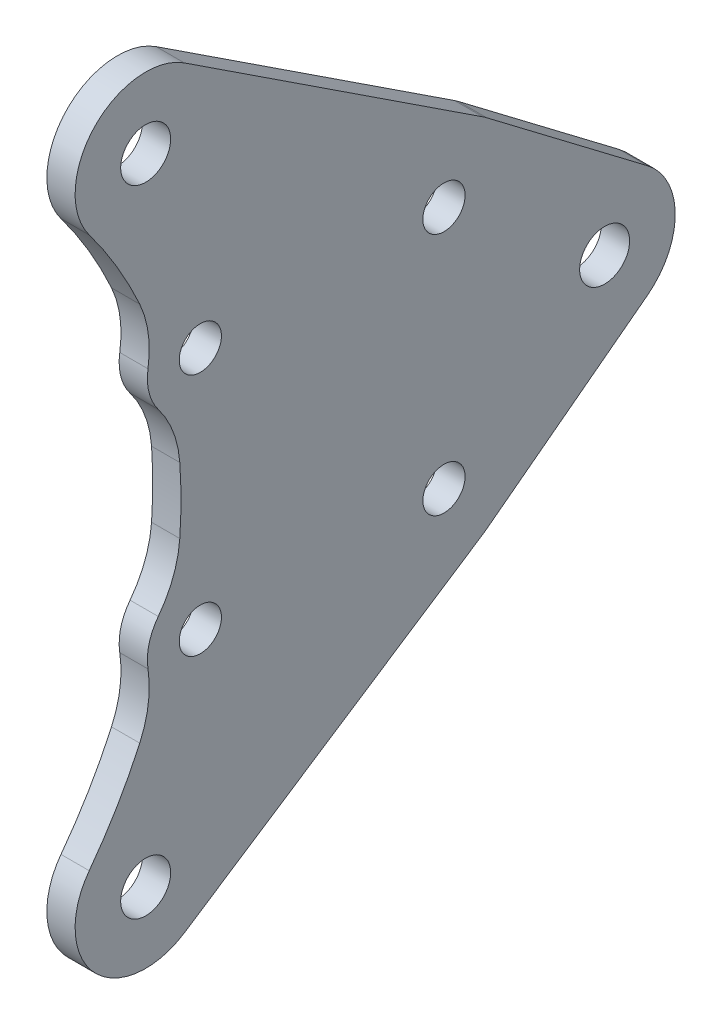
ISO-10303-21;
HEADER;
FILE_DESCRIPTION(('STEP AP214'),'2;1');
FILE_NAME('part.step','',(''),(''),'','','');
FILE_SCHEMA(('AUTOMOTIVE_DESIGN { 1 0 10303 214 1 1 1 1 }'));
ENDSEC;
DATA;
#1=APPLICATION_CONTEXT('core data for automotive mechanical design processes');
#2=APPLICATION_PROTOCOL_DEFINITION('international standard','automotive_design',2000,#1);
#3=PRODUCT_CONTEXT('',#1,'mechanical');
#4=PRODUCT('Part','Part','',(#3));
#5=PRODUCT_RELATED_PRODUCT_CATEGORY('part','',(#4));
#6=PRODUCT_DEFINITION_FORMATION('','',#4);
#7=PRODUCT_DEFINITION_CONTEXT('part definition',#1,'design');
#8=PRODUCT_DEFINITION('design','',#6,#7);
#9=PRODUCT_DEFINITION_SHAPE('','',#8);
#10=(LENGTH_UNIT() NAMED_UNIT(*) SI_UNIT(.MILLI.,.METRE.));
#11=(NAMED_UNIT(*) PLANE_ANGLE_UNIT() SI_UNIT($,.RADIAN.));
#12=(NAMED_UNIT(*) SI_UNIT($,.STERADIAN.) SOLID_ANGLE_UNIT());
#13=UNCERTAINTY_MEASURE_WITH_UNIT(LENGTH_MEASURE(1.E-05),#10,'distance_accuracy_value','');
#14=(GEOMETRIC_REPRESENTATION_CONTEXT(3) GLOBAL_UNCERTAINTY_ASSIGNED_CONTEXT((#13)) GLOBAL_UNIT_ASSIGNED_CONTEXT((#10,
#11,#12)) REPRESENTATION_CONTEXT('',''));
#15=CARTESIAN_POINT('',(0.,0.,0.));
#16=DIRECTION('',(0.,0.,1.));
#17=DIRECTION('',(1.,0.,0.));
#18=AXIS2_PLACEMENT_3D('',#15,#16,#17);
#19=CARTESIAN_POINT('',(2.54,0.,-25.4127));
#20=DIRECTION('',(-1.,0.,0.));
#21=DIRECTION('',(0.,0.,1.));
#22=AXIS2_PLACEMENT_3D('',#19,#20,#21);
#23=CYLINDRICAL_SURFACE('',#22,6.35);
#24=CARTESIAN_POINT('',(0.,0.,-25.4127));
#25=DIRECTION('',(1.,0.,0.));
#26=DIRECTION('',(0.,0.,-1.));
#27=AXIS2_PLACEMENT_3D('',#24,#25,#26);
#28=CIRCLE('',#27,6.35);
#29=CARTESIAN_POINT('',(0.,-5.05965389172381,-29.2496783027748));
#30=VERTEX_POINT('',#29);
#31=CARTESIAN_POINT('',(0.,5.05965389172381,-29.2496783027747));
#32=VERTEX_POINT('',#31);
#33=EDGE_CURVE('E191',#30,#32,#28,.T.);
#34=ORIENTED_EDGE('',*,*,#33,.T.);
#35=DIRECTION('',(-1.,0.,0.));
#36=VECTOR('',#35,1.);
#37=CARTESIAN_POINT('',(2.54,5.05965389172381,-29.2496783027747));
#38=LINE('',#37,#36);
#39=CARTESIAN_POINT('',(2.54,5.05965389172381,-29.2496783027747));
#40=VERTEX_POINT('',#39);
#41=EDGE_CURVE('E11',#40,#32,#38,.T.);
#42=ORIENTED_EDGE('',*,*,#41,.F.);
#43=CARTESIAN_POINT('',(2.54,0.,-25.4127));
#44=DIRECTION('',(1.,0.,0.));
#45=DIRECTION('',(0.,0.,-1.));
#46=AXIS2_PLACEMENT_3D('',#43,#44,#45);
#47=CIRCLE('',#46,6.35);
#48=CARTESIAN_POINT('',(2.54,-5.05965389172381,-29.2496783027748));
#49=VERTEX_POINT('',#48);
#50=EDGE_CURVE('E226',#49,#40,#47,.T.);
#51=ORIENTED_EDGE('',*,*,#50,.F.);
#52=DIRECTION('',(-1.,0.,0.));
#53=VECTOR('',#52,1.);
#54=CARTESIAN_POINT('',(2.54,-5.05965389172381,-29.2496783027748));
#55=LINE('',#54,#53);
#56=EDGE_CURVE('E187',#49,#30,#55,.T.);
#57=ORIENTED_EDGE('',*,*,#56,.T.);
#58=EDGE_LOOP('',(#34,#42,#51,#57));
#59=FACE_BOUND('',#58,.T.);
#60=ADVANCED_FACE('F35',(#59),#23,.T.);
#61=CARTESIAN_POINT('',(2.54,5.05965389172381,-29.2496783027747));
#62=DIRECTION('',(0.,-0.796795888460446,0.604248551618065));
#63=DIRECTION('',(0.,-0.604248551618065,-0.796795888460446));
#64=AXIS2_PLACEMENT_3D('',#61,#62,#63);
#65=PLANE('',#64);
#66=DIRECTION('',(0.,0.604248551618065,0.796795888460446));
#67=VECTOR('',#66,1.);
#68=CARTESIAN_POINT('',(0.,5.05965389172381,-29.2496783027747));
#69=LINE('',#68,#67);
#70=CARTESIAN_POINT('',(0.,16.0197538917236,-14.7970783027749));
#71=VERTEX_POINT('',#70);
#72=EDGE_CURVE('E194',#32,#71,#69,.T.);
#73=ORIENTED_EDGE('',*,*,#72,.T.);
#74=DIRECTION('',(-1.,0.,0.));
#75=VECTOR('',#74,1.);
#76=CARTESIAN_POINT('',(2.54,16.0197538917236,-14.7970783027749));
#77=LINE('',#76,#75);
#78=CARTESIAN_POINT('',(2.54,16.0197538917236,-14.7970783027749));
#79=VERTEX_POINT('',#78);
#80=EDGE_CURVE('E43',#79,#71,#77,.T.);
#81=ORIENTED_EDGE('',*,*,#80,.F.);
#82=DIRECTION('',(0.,0.604248551618065,0.796795888460446));
#83=VECTOR('',#82,1.);
#84=CARTESIAN_POINT('',(2.54,5.05965389172381,-29.2496783027747));
#85=LINE('',#84,#83);
#86=EDGE_CURVE('E124',#40,#79,#85,.T.);
#87=ORIENTED_EDGE('',*,*,#86,.F.);
#88=ORIENTED_EDGE('',*,*,#41,.T.);
#89=EDGE_LOOP('',(#73,#81,#87,#88));
#90=FACE_BOUND('',#89,.T.);
#91=ADVANCED_FACE('F335',(#90),#65,.F.);
#92=CARTESIAN_POINT('',(2.54,10.9600999999998,-10.9601000000001));
#93=DIRECTION('',(-1.,0.,0.));
#94=DIRECTION('',(0.,0.,1.));
#95=AXIS2_PLACEMENT_3D('',#92,#93,#94);
#96=CYLINDRICAL_SURFACE('',#95,6.35);
#97=CARTESIAN_POINT('',(0.,10.9600999999998,-10.9601000000001));
#98=DIRECTION('',(1.,0.,0.));
#99=DIRECTION('',(0.,0.,-1.));
#100=AXIS2_PLACEMENT_3D('',#97,#98,#99);
#101=CIRCLE('',#100,6.35);
#102=CARTESIAN_POINT('',(0.,16.2686080607358,-14.4446720209376));
#103=VERTEX_POINT('',#102);
#104=EDGE_CURVE('E197',#71,#103,#101,.T.);
#105=ORIENTED_EDGE('',*,*,#104,.T.);
#106=DIRECTION('',(-1.,0.,0.));
#107=VECTOR('',#106,1.);
#108=CARTESIAN_POINT('',(2.54,16.2686080607358,-14.4446720209376));
#109=LINE('',#108,#107);
#110=CARTESIAN_POINT('',(2.54,16.2686080607358,-14.4446720209376));
#111=VERTEX_POINT('',#110);
#112=EDGE_CURVE('E263',#111,#103,#109,.T.);
#113=ORIENTED_EDGE('',*,*,#112,.F.);
#114=CARTESIAN_POINT('',(2.54,10.9600999999998,-10.9601000000001));
#115=DIRECTION('',(1.,0.,0.));
#116=DIRECTION('',(0.,0.,-1.));
#117=AXIS2_PLACEMENT_3D('',#114,#115,#116);
#118=CIRCLE('',#117,6.35);
#119=EDGE_CURVE('E271',#79,#111,#118,.T.);
#120=ORIENTED_EDGE('',*,*,#119,.F.);
#121=ORIENTED_EDGE('',*,*,#80,.T.);
#122=EDGE_LOOP('',(#105,#113,#120,#121));
#123=FACE_BOUND('',#122,.T.);
#124=ADVANCED_FACE('F269',(#123),#96,.T.);
#125=CARTESIAN_POINT('',(2.54,16.2686080607358,-14.4446720209376));
#126=DIRECTION('',(0.,-0.835985521375755,0.548751499360236));
#127=DIRECTION('',(0.,-0.548751499360236,-0.835985521375755));
#128=AXIS2_PLACEMENT_3D('',#125,#126,#127);
#129=PLANE('',#128);
#130=DIRECTION('',(0.,0.548751499360236,0.835985521375755));
#131=VECTOR('',#130,1.);
#132=CARTESIAN_POINT('',(0.,16.2686080607358,-14.4446720209376));
#133=LINE('',#132,#131);
#134=CARTESIAN_POINT('',(0.,33.883508060736,12.3904279790625));
#135=VERTEX_POINT('',#134);
#136=EDGE_CURVE('E199',#103,#135,#133,.T.);
#137=ORIENTED_EDGE('',*,*,#136,.T.);
#138=DIRECTION('',(-1.,0.,0.));
#139=VECTOR('',#138,1.);
#140=CARTESIAN_POINT('',(2.54,33.883508060736,12.3904279790625));
#141=LINE('',#140,#139);
#142=CARTESIAN_POINT('',(2.54,33.883508060736,12.3904279790625));
#143=VERTEX_POINT('',#142);
#144=EDGE_CURVE('E260',#143,#135,#141,.T.);
#145=ORIENTED_EDGE('',*,*,#144,.F.);
#146=DIRECTION('',(0.,0.548751499360236,0.835985521375755));
#147=VECTOR('',#146,1.);
#148=CARTESIAN_POINT('',(2.54,16.2686080607358,-14.4446720209376));
#149=LINE('',#148,#147);
#150=EDGE_CURVE('E289',#111,#143,#149,.T.);
#151=ORIENTED_EDGE('',*,*,#150,.F.);
#152=ORIENTED_EDGE('',*,*,#112,.T.);
#153=EDGE_LOOP('',(#137,#145,#151,#152));
#154=FACE_BOUND('',#153,.T.);
#155=ADVANCED_FACE('F280',(#154),#129,.F.);
#156=CARTESIAN_POINT('',(2.54,28.575,15.875));
#157=DIRECTION('',(-1.,0.,0.));
#158=DIRECTION('',(0.,0.,1.));
#159=AXIS2_PLACEMENT_3D('',#156,#157,#158);
#160=CYLINDRICAL_SURFACE('',#159,6.35);
#161=CARTESIAN_POINT('',(0.,28.575,15.875));
#162=DIRECTION('',(1.,0.,0.));
#163=DIRECTION('',(0.,0.,-1.));
#164=AXIS2_PLACEMENT_3D('',#161,#162,#163);
#165=CIRCLE('',#164,6.35);
#166=CARTESIAN_POINT('',(0.,24.765,20.955));
#167=VERTEX_POINT('',#166);
#168=EDGE_CURVE('E201',#135,#167,#165,.T.);
#169=ORIENTED_EDGE('',*,*,#168,.T.);
#170=DIRECTION('',(-1.,0.,0.));
#171=VECTOR('',#170,1.);
#172=CARTESIAN_POINT('',(2.54,24.765,20.955));
#173=LINE('',#172,#171);
#174=CARTESIAN_POINT('',(2.54,24.765,20.955));
#175=VERTEX_POINT('',#174);
#176=EDGE_CURVE('E257',#175,#167,#173,.T.);
#177=ORIENTED_EDGE('',*,*,#176,.F.);
#178=CARTESIAN_POINT('',(2.54,28.575,15.875));
#179=DIRECTION('',(1.,0.,0.));
#180=DIRECTION('',(0.,0.,-1.));
#181=AXIS2_PLACEMENT_3D('',#178,#179,#180);
#182=CIRCLE('',#181,6.35);
#183=EDGE_CURVE('E286',#143,#175,#182,.T.);
#184=ORIENTED_EDGE('',*,*,#183,.F.);
#185=ORIENTED_EDGE('',*,*,#144,.T.);
#186=EDGE_LOOP('',(#169,#177,#184,#185));
#187=FACE_BOUND('',#186,.T.);
#188=ADVANCED_FACE('F284',(#187),#160,.T.);
#189=CARTESIAN_POINT('',(2.54,0.,53.975));
#190=DIRECTION('',(-1.,0.,0.));
#191=DIRECTION('',(0.,0.,1.));
#192=AXIS2_PLACEMENT_3D('',#189,#190,#191);
#193=CYLINDRICAL_SURFACE('',#192,41.275);
#194=CARTESIAN_POINT('',(0.,0.,53.975));
#195=DIRECTION('',(-1.,0.,0.));
#196=DIRECTION('',(0.,0.,-1.));
#197=AXIS2_PLACEMENT_3D('',#194,#195,#196);
#198=CIRCLE('',#197,41.275);
#199=CARTESIAN_POINT('',(0.,17.1004614147341,16.409060048986));
#200=VERTEX_POINT('',#199);
#201=EDGE_CURVE('E203',#167,#200,#198,.T.);
#202=ORIENTED_EDGE('',*,*,#201,.T.);
#203=DIRECTION('',(-1.,0.,0.));
#204=VECTOR('',#203,1.);
#205=CARTESIAN_POINT('',(2.54,17.1004614147341,16.409060048986));
#206=LINE('',#205,#204);
#207=CARTESIAN_POINT('',(2.54,17.1004614147341,16.409060048986));
#208=VERTEX_POINT('',#207);
#209=EDGE_CURVE('E254',#208,#200,#206,.T.);
#210=ORIENTED_EDGE('',*,*,#209,.F.);
#211=CARTESIAN_POINT('',(2.54,0.,53.975));
#212=DIRECTION('',(-1.,0.,0.));
#213=DIRECTION('',(0.,0.,-1.));
#214=AXIS2_PLACEMENT_3D('',#211,#212,#213);
#215=CIRCLE('',#214,41.275);
#216=EDGE_CURVE('E288',#175,#208,#215,.T.);
#217=ORIENTED_EDGE('',*,*,#216,.F.);
#218=ORIENTED_EDGE('',*,*,#176,.T.);
#219=EDGE_LOOP('',(#202,#210,#217,#218));
#220=FACE_BOUND('',#219,.T.);
#221=ADVANCED_FACE('F348',(#220),#193,.F.);
#222=CARTESIAN_POINT('',(2.54,13.154201088257,25.0781231146046));
#223=DIRECTION('',(-1.,0.,0.));
#224=DIRECTION('',(0.,0.,1.));
#225=AXIS2_PLACEMENT_3D('',#222,#223,#224);
#226=CYLINDRICAL_SURFACE('',#225,9.52499999999999);
#227=CARTESIAN_POINT('',(0.,13.154201088257,25.0781231146046));
#228=DIRECTION('',(-1.,0.,0.));
#229=DIRECTION('',(0.,0.,-1.));
#230=AXIS2_PLACEMENT_3D('',#227,#228,#229);
#231=CIRCLE('',#230,9.52499999999999);
#232=CARTESIAN_POINT('',(0.,11.691467029419,15.6661077048682));
#233=VERTEX_POINT('',#232);
#234=EDGE_CURVE('E205',#200,#233,#231,.T.);
#235=ORIENTED_EDGE('',*,*,#234,.T.);
#236=DIRECTION('',(-1.,0.,0.));
#237=VECTOR('',#236,1.);
#238=CARTESIAN_POINT('',(2.54,11.691467029419,15.6661077048682));
#239=LINE('',#238,#237);
#240=CARTESIAN_POINT('',(2.54,11.691467029419,15.6661077048682));
#241=VERTEX_POINT('',#240);
#242=EDGE_CURVE('E251',#241,#233,#239,.T.);
#243=ORIENTED_EDGE('',*,*,#242,.F.);
#244=CARTESIAN_POINT('',(2.54,13.154201088257,25.0781231146046));
#245=DIRECTION('',(-1.,0.,0.));
#246=DIRECTION('',(0.,0.,-1.));
#247=AXIS2_PLACEMENT_3D('',#244,#245,#246);
#248=CIRCLE('',#247,9.52499999999999);
#249=EDGE_CURVE('E291',#208,#241,#248,.T.);
#250=ORIENTED_EDGE('',*,*,#249,.F.);
#251=ORIENTED_EDGE('',*,*,#209,.T.);
#252=EDGE_LOOP('',(#235,#243,#250,#251));
#253=FACE_BOUND('',#252,.T.);
#254=ADVANCED_FACE('F351',(#253),#226,.F.);
#255=CARTESIAN_POINT('',(2.54,10.9601,10.9601));
#256=DIRECTION('',(-1.,0.,0.));
#257=DIRECTION('',(0.,0.,1.));
#258=AXIS2_PLACEMENT_3D('',#255,#256,#257);
#259=CYLINDRICAL_SURFACE('',#258,4.7625);
#260=CARTESIAN_POINT('',(0.,10.9601,10.9601));
#261=DIRECTION('',(1.,0.,0.));
#262=DIRECTION('',(0.,0.,-1.));
#263=AXIS2_PLACEMENT_3D('',#260,#261,#262);
#264=CIRCLE('',#263,4.7625);
#265=CARTESIAN_POINT('',(0.,8.06594812661788,14.7423336236408));
#266=VERTEX_POINT('',#265);
#267=EDGE_CURVE('E207',#233,#266,#264,.T.);
#268=ORIENTED_EDGE('',*,*,#267,.T.);
#269=DIRECTION('',(-1.,0.,0.));
#270=VECTOR('',#269,1.);
#271=CARTESIAN_POINT('',(2.54,8.06594812661788,14.7423336236408));
#272=LINE('',#271,#270);
#273=CARTESIAN_POINT('',(2.54,8.06594812661788,14.7423336236408));
#274=VERTEX_POINT('',#273);
#275=EDGE_CURVE('E248',#274,#266,#272,.T.);
#276=ORIENTED_EDGE('',*,*,#275,.F.);
#277=CARTESIAN_POINT('',(2.54,10.9601,10.9601));
#278=DIRECTION('',(1.,0.,0.));
#279=DIRECTION('',(0.,0.,-1.));
#280=AXIS2_PLACEMENT_3D('',#277,#278,#279);
#281=CIRCLE('',#280,4.7625);
#282=EDGE_CURVE('E297',#241,#274,#281,.T.);
#283=ORIENTED_EDGE('',*,*,#282,.F.);
#284=ORIENTED_EDGE('',*,*,#242,.T.);
#285=EDGE_LOOP('',(#268,#276,#283,#284));
#286=FACE_BOUND('',#285,.T.);
#287=ADVANCED_FACE('F355',(#286),#259,.T.);
#288=CARTESIAN_POINT('',(2.54,2.27764437985357,22.3068008709222));
#289=DIRECTION('',(-1.,0.,0.));
#290=DIRECTION('',(0.,0.,1.));
#291=AXIS2_PLACEMENT_3D('',#288,#289,#290);
#292=CYLINDRICAL_SURFACE('',#291,9.525);
#293=CARTESIAN_POINT('',(0.,2.27764437985357,22.3068008709222));
#294=DIRECTION('',(-1.,0.,0.));
#295=DIRECTION('',(0.,0.,1.));
#296=AXIS2_PLACEMENT_3D('',#293,#294,#295);
#297=CIRCLE('',#296,9.525);
#298=CARTESIAN_POINT('',(0.,2.96093769380964,12.8063411321989));
#299=VERTEX_POINT('',#298);
#300=EDGE_CURVE('E209',#266,#299,#297,.T.);
#301=ORIENTED_EDGE('',*,*,#300,.T.);
#302=DIRECTION('',(-1.,0.,0.));
#303=VECTOR('',#302,1.);
#304=CARTESIAN_POINT('',(2.54,2.96093769380964,12.8063411321989));
#305=LINE('',#304,#303);
#306=CARTESIAN_POINT('',(2.54,2.96093769380964,12.8063411321989));
#307=VERTEX_POINT('',#306);
#308=EDGE_CURVE('E245',#307,#299,#305,.T.);
#309=ORIENTED_EDGE('',*,*,#308,.F.);
#310=CARTESIAN_POINT('',(2.54,2.27764437985357,22.3068008709222));
#311=DIRECTION('',(-1.,0.,0.));
#312=DIRECTION('',(0.,0.,1.));
#313=AXIS2_PLACEMENT_3D('',#310,#311,#312);
#314=CIRCLE('',#313,9.525);
#315=EDGE_CURVE('E299',#274,#307,#314,.T.);
#316=ORIENTED_EDGE('',*,*,#315,.F.);
#317=ORIENTED_EDGE('',*,*,#275,.T.);
#318=EDGE_LOOP('',(#301,#309,#316,#317));
#319=FACE_BOUND('',#318,.T.);
#320=ADVANCED_FACE('F359',(#319),#292,.F.);
#321=CARTESIAN_POINT('',(2.54,0.,53.975));
#322=DIRECTION('',(-1.,0.,0.));
#323=DIRECTION('',(0.,0.,1.));
#324=AXIS2_PLACEMENT_3D('',#321,#322,#323);
#325=CYLINDRICAL_SURFACE('',#324,41.275);
#326=CARTESIAN_POINT('',(0.,0.,53.975));
#327=DIRECTION('',(-1.,0.,0.));
#328=DIRECTION('',(0.,0.,-1.));
#329=AXIS2_PLACEMENT_3D('',#326,#327,#328);
#330=CIRCLE('',#329,41.275);
#331=CARTESIAN_POINT('',(0.,-2.96093769380944,12.8063411321989));
#332=VERTEX_POINT('',#331);
#333=EDGE_CURVE('E211',#299,#332,#330,.T.);
#334=ORIENTED_EDGE('',*,*,#333,.T.);
#335=DIRECTION('',(-1.,0.,0.));
#336=VECTOR('',#335,1.);
#337=CARTESIAN_POINT('',(2.54,-2.96093769380944,12.8063411321989));
#338=LINE('',#337,#336);
#339=CARTESIAN_POINT('',(2.54,-2.96093769380944,12.8063411321989));
#340=VERTEX_POINT('',#339);
#341=EDGE_CURVE('E242',#340,#332,#338,.T.);
#342=ORIENTED_EDGE('',*,*,#341,.F.);
#343=CARTESIAN_POINT('',(2.54,0.,53.975));
#344=DIRECTION('',(-1.,0.,0.));
#345=DIRECTION('',(0.,0.,-1.));
#346=AXIS2_PLACEMENT_3D('',#343,#344,#345);
#347=CIRCLE('',#346,41.275);
#348=EDGE_CURVE('E301',#307,#340,#347,.T.);
#349=ORIENTED_EDGE('',*,*,#348,.F.);
#350=ORIENTED_EDGE('',*,*,#308,.T.);
#351=EDGE_LOOP('',(#334,#342,#349,#350));
#352=FACE_BOUND('',#351,.T.);
#353=ADVANCED_FACE('F363',(#352),#325,.F.);
#354=CARTESIAN_POINT('',(2.54,-2.27764437985341,22.3068008709222));
#355=DIRECTION('',(-1.,0.,0.));
#356=DIRECTION('',(0.,0.,1.));
#357=AXIS2_PLACEMENT_3D('',#354,#355,#356);
#358=CYLINDRICAL_SURFACE('',#357,9.525);
#359=CARTESIAN_POINT('',(0.,-2.27764437985341,22.3068008709222));
#360=DIRECTION('',(-1.,0.,0.));
#361=DIRECTION('',(0.,0.,-1.));
#362=AXIS2_PLACEMENT_3D('',#359,#360,#361);
#363=CIRCLE('',#362,9.525);
#364=CARTESIAN_POINT('',(0.,-8.06594812661781,14.7423336236408));
#365=VERTEX_POINT('',#364);
#366=EDGE_CURVE('E213',#332,#365,#363,.T.);
#367=ORIENTED_EDGE('',*,*,#366,.T.);
#368=DIRECTION('',(-1.,0.,0.));
#369=VECTOR('',#368,1.);
#370=CARTESIAN_POINT('',(2.54,-8.06594812661781,14.7423336236408));
#371=LINE('',#370,#369);
#372=CARTESIAN_POINT('',(2.54,-8.06594812661781,14.7423336236408));
#373=VERTEX_POINT('',#372);
#374=EDGE_CURVE('E239',#373,#365,#371,.T.);
#375=ORIENTED_EDGE('',*,*,#374,.F.);
#376=CARTESIAN_POINT('',(2.54,-2.27764437985341,22.3068008709222));
#377=DIRECTION('',(-1.,0.,0.));
#378=DIRECTION('',(0.,0.,-1.));
#379=AXIS2_PLACEMENT_3D('',#376,#377,#378);
#380=CIRCLE('',#379,9.525);
#381=EDGE_CURVE('E303',#340,#373,#380,.T.);
#382=ORIENTED_EDGE('',*,*,#381,.F.);
#383=ORIENTED_EDGE('',*,*,#341,.T.);
#384=EDGE_LOOP('',(#367,#375,#382,#383));
#385=FACE_BOUND('',#384,.T.);
#386=ADVANCED_FACE('F367',(#385),#358,.F.);
#387=CARTESIAN_POINT('',(2.54,-10.9601,10.9601000000001));
#388=DIRECTION('',(-1.,0.,0.));
#389=DIRECTION('',(0.,0.,1.));
#390=AXIS2_PLACEMENT_3D('',#387,#388,#389);
#391=CYLINDRICAL_SURFACE('',#390,4.7625);
#392=CARTESIAN_POINT('',(0.,-10.9601,10.9601000000001));
#393=DIRECTION('',(1.,0.,0.));
#394=DIRECTION('',(0.,0.,-1.));
#395=AXIS2_PLACEMENT_3D('',#392,#393,#394);
#396=CIRCLE('',#395,4.7625);
#397=CARTESIAN_POINT('',(0.,-11.6914670294191,15.6661077048683));
#398=VERTEX_POINT('',#397);
#399=EDGE_CURVE('E215',#365,#398,#396,.T.);
#400=ORIENTED_EDGE('',*,*,#399,.T.);
#401=DIRECTION('',(-1.,0.,0.));
#402=VECTOR('',#401,1.);
#403=CARTESIAN_POINT('',(2.54,-11.6914670294191,15.6661077048683));
#404=LINE('',#403,#402);
#405=CARTESIAN_POINT('',(2.54,-11.6914670294191,15.6661077048683));
#406=VERTEX_POINT('',#405);
#407=EDGE_CURVE('E236',#406,#398,#404,.T.);
#408=ORIENTED_EDGE('',*,*,#407,.F.);
#409=CARTESIAN_POINT('',(2.54,-10.9601,10.9601000000001));
#410=DIRECTION('',(1.,0.,0.));
#411=DIRECTION('',(0.,0.,-1.));
#412=AXIS2_PLACEMENT_3D('',#409,#410,#411);
#413=CIRCLE('',#412,4.7625);
#414=EDGE_CURVE('E305',#373,#406,#413,.T.);
#415=ORIENTED_EDGE('',*,*,#414,.F.);
#416=ORIENTED_EDGE('',*,*,#374,.T.);
#417=EDGE_LOOP('',(#400,#408,#415,#416));
#418=FACE_BOUND('',#417,.T.);
#419=ADVANCED_FACE('F371',(#418),#391,.T.);
#420=CARTESIAN_POINT('',(2.54,-13.1542010882571,25.0781231146047));
#421=DIRECTION('',(-1.,0.,0.));
#422=DIRECTION('',(0.,0.,1.));
#423=AXIS2_PLACEMENT_3D('',#420,#421,#422);
#424=CYLINDRICAL_SURFACE('',#423,9.525);
#425=CARTESIAN_POINT('',(0.,-13.1542010882571,25.0781231146047));
#426=DIRECTION('',(-1.,0.,0.));
#427=DIRECTION('',(0.,0.,1.));
#428=AXIS2_PLACEMENT_3D('',#425,#426,#427);
#429=CIRCLE('',#428,9.525);
#430=CARTESIAN_POINT('',(0.,-17.1004614147343,16.4090600489861));
#431=VERTEX_POINT('',#430);
#432=EDGE_CURVE('E217',#398,#431,#429,.T.);
#433=ORIENTED_EDGE('',*,*,#432,.T.);
#434=DIRECTION('',(-1.,0.,0.));
#435=VECTOR('',#434,1.);
#436=CARTESIAN_POINT('',(2.54,-17.1004614147343,16.4090600489861));
#437=LINE('',#436,#435);
#438=CARTESIAN_POINT('',(2.54,-17.1004614147343,16.4090600489861));
#439=VERTEX_POINT('',#438);
#440=EDGE_CURVE('E233',#439,#431,#437,.T.);
#441=ORIENTED_EDGE('',*,*,#440,.F.);
#442=CARTESIAN_POINT('',(2.54,-13.1542010882571,25.0781231146047));
#443=DIRECTION('',(-1.,0.,0.));
#444=DIRECTION('',(0.,0.,1.));
#445=AXIS2_PLACEMENT_3D('',#442,#443,#444);
#446=CIRCLE('',#445,9.525);
#447=EDGE_CURVE('E307',#406,#439,#446,.T.);
#448=ORIENTED_EDGE('',*,*,#447,.F.);
#449=ORIENTED_EDGE('',*,*,#407,.T.);
#450=EDGE_LOOP('',(#433,#441,#448,#449));
#451=FACE_BOUND('',#450,.T.);
#452=ADVANCED_FACE('F375',(#451),#424,.F.);
#453=CARTESIAN_POINT('',(2.54,0.,53.975));
#454=DIRECTION('',(-1.,0.,0.));
#455=DIRECTION('',(0.,0.,1.));
#456=AXIS2_PLACEMENT_3D('',#453,#454,#455);
#457=CYLINDRICAL_SURFACE('',#456,41.275);
#458=CARTESIAN_POINT('',(0.,0.,53.975));
#459=DIRECTION('',(-1.,0.,0.));
#460=DIRECTION('',(0.,0.,-1.));
#461=AXIS2_PLACEMENT_3D('',#458,#459,#460);
#462=CIRCLE('',#461,41.275);
#463=CARTESIAN_POINT('',(0.,-24.765,20.955));
#464=VERTEX_POINT('',#463);
#465=EDGE_CURVE('E219',#431,#464,#462,.T.);
#466=ORIENTED_EDGE('',*,*,#465,.T.);
#467=DIRECTION('',(-1.,0.,0.));
#468=VECTOR('',#467,1.);
#469=CARTESIAN_POINT('',(2.54,-24.765,20.955));
#470=LINE('',#469,#468);
#471=CARTESIAN_POINT('',(2.54,-24.765,20.955));
#472=VERTEX_POINT('',#471);
#473=EDGE_CURVE('E230',#472,#464,#470,.T.);
#474=ORIENTED_EDGE('',*,*,#473,.F.);
#475=CARTESIAN_POINT('',(2.54,0.,53.975));
#476=DIRECTION('',(-1.,0.,0.));
#477=DIRECTION('',(0.,0.,-1.));
#478=AXIS2_PLACEMENT_3D('',#475,#476,#477);
#479=CIRCLE('',#478,41.275);
#480=EDGE_CURVE('E309',#439,#472,#479,.T.);
#481=ORIENTED_EDGE('',*,*,#480,.F.);
#482=ORIENTED_EDGE('',*,*,#440,.T.);
#483=EDGE_LOOP('',(#466,#474,#481,#482));
#484=FACE_BOUND('',#483,.T.);
#485=ADVANCED_FACE('F315',(#484),#457,.F.);
#486=CARTESIAN_POINT('',(2.54,-28.575,15.875));
#487=DIRECTION('',(-1.,0.,0.));
#488=DIRECTION('',(0.,0.,1.));
#489=AXIS2_PLACEMENT_3D('',#486,#487,#488);
#490=CYLINDRICAL_SURFACE('',#489,6.35);
#491=CARTESIAN_POINT('',(0.,-28.575,15.875));
#492=DIRECTION('',(1.,0.,0.));
#493=DIRECTION('',(0.,0.,-1.));
#494=AXIS2_PLACEMENT_3D('',#491,#492,#493);
#495=CIRCLE('',#494,6.35);
#496=CARTESIAN_POINT('',(0.,-33.8835080607361,12.3904279790625));
#497=VERTEX_POINT('',#496);
#498=EDGE_CURVE('E221',#464,#497,#495,.T.);
#499=ORIENTED_EDGE('',*,*,#498,.T.);
#500=DIRECTION('',(-1.,0.,0.));
#501=VECTOR('',#500,1.);
#502=CARTESIAN_POINT('',(2.54,-33.8835080607361,12.3904279790625));
#503=LINE('',#502,#501);
#504=CARTESIAN_POINT('',(2.54,-33.8835080607361,12.3904279790625));
#505=VERTEX_POINT('',#504);
#506=EDGE_CURVE('E182',#505,#497,#503,.T.);
#507=ORIENTED_EDGE('',*,*,#506,.F.);
#508=CARTESIAN_POINT('',(2.54,-28.575,15.875));
#509=DIRECTION('',(1.,0.,0.));
#510=DIRECTION('',(0.,0.,-1.));
#511=AXIS2_PLACEMENT_3D('',#508,#509,#510);
#512=CIRCLE('',#511,6.35);
#513=EDGE_CURVE('E173',#472,#505,#512,.T.);
#514=ORIENTED_EDGE('',*,*,#513,.F.);
#515=ORIENTED_EDGE('',*,*,#473,.T.);
#516=EDGE_LOOP('',(#499,#507,#514,#515));
#517=FACE_BOUND('',#516,.T.);
#518=ADVANCED_FACE('F319',(#517),#490,.T.);
#519=CARTESIAN_POINT('',(2.54,-16.2686080607362,-14.4446720209375));
#520=DIRECTION('',(0.,0.835985521375758,0.548751499360231));
#521=DIRECTION('',(0.,-0.548751499360231,0.835985521375758));
#522=AXIS2_PLACEMENT_3D('',#519,#520,#521);
#523=PLANE('',#522);
#524=DIRECTION('',(0.,0.548751499360231,-0.835985521375758));
#525=VECTOR('',#524,1.);
#526=CARTESIAN_POINT('',(0.,-16.2686080607362,-14.4446720209375));
#527=LINE('',#526,#525);
#528=CARTESIAN_POINT('',(0.,-16.2686080607362,-14.4446720209375));
#529=VERTEX_POINT('',#528);
#530=EDGE_CURVE('E181',#497,#529,#527,.T.);
#531=ORIENTED_EDGE('',*,*,#530,.T.);
#532=DIRECTION('',(-1.,0.,0.));
#533=VECTOR('',#532,1.);
#534=CARTESIAN_POINT('',(2.54,-16.2686080607362,-14.4446720209375));
#535=LINE('',#534,#533);
#536=CARTESIAN_POINT('',(2.54,-16.2686080607362,-14.4446720209375));
#537=VERTEX_POINT('',#536);
#538=EDGE_CURVE('E178',#537,#529,#535,.T.);
#539=ORIENTED_EDGE('',*,*,#538,.F.);
#540=DIRECTION('',(0.,0.548751499360231,-0.835985521375758));
#541=VECTOR('',#540,1.);
#542=CARTESIAN_POINT('',(2.54,-16.2686080607362,-14.4446720209375));
#543=LINE('',#542,#541);
#544=EDGE_CURVE('E167',#505,#537,#543,.T.);
#545=ORIENTED_EDGE('',*,*,#544,.F.);
#546=ORIENTED_EDGE('',*,*,#506,.T.);
#547=EDGE_LOOP('',(#531,#539,#545,#546));
#548=FACE_BOUND('',#547,.T.);
#549=ADVANCED_FACE('F179',(#548),#523,.F.);
#550=CARTESIAN_POINT('',(2.54,-10.9601000000001,-10.9601));
#551=DIRECTION('',(-1.,0.,0.));
#552=DIRECTION('',(0.,0.,1.));
#553=AXIS2_PLACEMENT_3D('',#550,#551,#552);
#554=CYLINDRICAL_SURFACE('',#553,6.35);
#555=CARTESIAN_POINT('',(0.,-10.9601000000001,-10.9601));
#556=DIRECTION('',(1.,0.,0.));
#557=DIRECTION('',(0.,0.,-1.));
#558=AXIS2_PLACEMENT_3D('',#555,#556,#557);
#559=CIRCLE('',#558,6.35);
#560=CARTESIAN_POINT('',(0.,-16.0197538917239,-14.7970783027748));
#561=VERTEX_POINT('',#560);
#562=EDGE_CURVE('E110',#529,#561,#559,.T.);
#563=ORIENTED_EDGE('',*,*,#562,.T.);
#564=DIRECTION('',(-1.,0.,0.));
#565=VECTOR('',#564,1.);
#566=CARTESIAN_POINT('',(2.54,-16.0197538917239,-14.7970783027748));
#567=LINE('',#566,#565);
#568=CARTESIAN_POINT('',(2.54,-16.0197538917239,-14.7970783027748));
#569=VERTEX_POINT('',#568);
#570=EDGE_CURVE('E183',#569,#561,#567,.T.);
#571=ORIENTED_EDGE('',*,*,#570,.F.);
#572=CARTESIAN_POINT('',(2.54,-10.9601000000001,-10.9601));
#573=DIRECTION('',(1.,0.,0.));
#574=DIRECTION('',(0.,0.,-1.));
#575=AXIS2_PLACEMENT_3D('',#572,#573,#574);
#576=CIRCLE('',#575,6.35);
#577=EDGE_CURVE('E171',#537,#569,#576,.T.);
#578=ORIENTED_EDGE('',*,*,#577,.F.);
#579=ORIENTED_EDGE('',*,*,#538,.T.);
#580=EDGE_LOOP('',(#563,#571,#578,#579));
#581=FACE_BOUND('',#580,.T.);
#582=ADVANCED_FACE('F185',(#581),#554,.T.);
#583=CARTESIAN_POINT('',(2.54,-5.05965389172381,-29.2496783027748));
#584=DIRECTION('',(0.,0.796795888460441,0.604248551618072));
#585=DIRECTION('',(0.,-0.604248551618072,0.796795888460441));
#586=AXIS2_PLACEMENT_3D('',#583,#584,#585);
#587=PLANE('',#586);
#588=DIRECTION('',(0.,0.604248551618072,-0.796795888460441));
#589=VECTOR('',#588,1.);
#590=CARTESIAN_POINT('',(0.,-5.05965389172381,-29.2496783027748));
#591=LINE('',#590,#589);
#592=EDGE_CURVE('E116',#561,#30,#591,.T.);
#593=ORIENTED_EDGE('',*,*,#592,.T.);
#594=ORIENTED_EDGE('',*,*,#56,.F.);
#595=DIRECTION('',(0.,0.604248551618072,-0.796795888460441));
#596=VECTOR('',#595,1.);
#597=CARTESIAN_POINT('',(2.54,-5.05965389172381,-29.2496783027748));
#598=LINE('',#597,#596);
#599=EDGE_CURVE('E51',#569,#49,#598,.T.);
#600=ORIENTED_EDGE('',*,*,#599,.F.);
#601=ORIENTED_EDGE('',*,*,#570,.T.);
#602=EDGE_LOOP('',(#593,#594,#600,#601));
#603=FACE_BOUND('',#602,.T.);
#604=ADVANCED_FACE('F323',(#603),#587,.F.);
#605=CARTESIAN_POINT('',(2.54,0.,-25.4127));
#606=DIRECTION('',(1.,0.,0.));
#607=DIRECTION('',(0.,0.,-1.));
#608=AXIS2_PLACEMENT_3D('',#605,#606,#607);
#609=PLANE('',#608);
#610=CARTESIAN_POINT('',(2.54,10.9601,10.9601));
#611=DIRECTION('',(1.,0.,0.));
#612=DIRECTION('',(0.,0.,-1.));
#613=AXIS2_PLACEMENT_3D('',#610,#611,#612);
#614=CIRCLE('',#613,1.89865);
#615=CARTESIAN_POINT('',(2.54,10.9601,9.06145000000001));
#616=VERTEX_POINT('',#615);
#617=EDGE_CURVE('E491',#616,#616,#614,.T.);
#618=ORIENTED_EDGE('',*,*,#617,.F.);
#619=EDGE_LOOP('',(#618));
#620=FACE_BOUND('',#619,.T.);
#621=CARTESIAN_POINT('',(2.54,10.9600999999999,-10.9601));
#622=DIRECTION('',(1.,0.,0.));
#623=DIRECTION('',(0.,0.,-1.));
#624=AXIS2_PLACEMENT_3D('',#621,#622,#623);
#625=CIRCLE('',#624,1.89865);
#626=CARTESIAN_POINT('',(2.54,10.9600999999999,-12.85875));
#627=VERTEX_POINT('',#626);
#628=EDGE_CURVE('E493',#627,#627,#625,.T.);
#629=ORIENTED_EDGE('',*,*,#628,.F.);
#630=EDGE_LOOP('',(#629));
#631=FACE_BOUND('',#630,.T.);
#632=CARTESIAN_POINT('',(2.54,-10.9601,10.9601000000001));
#633=DIRECTION('',(1.,0.,0.));
#634=DIRECTION('',(0.,0.,-1.));
#635=AXIS2_PLACEMENT_3D('',#632,#633,#634);
#636=CIRCLE('',#635,1.89865);
#637=CARTESIAN_POINT('',(2.54,-10.9601,9.06145000000011));
#638=VERTEX_POINT('',#637);
#639=EDGE_CURVE('E501',#638,#638,#636,.T.);
#640=ORIENTED_EDGE('',*,*,#639,.F.);
#641=EDGE_LOOP('',(#640));
#642=FACE_BOUND('',#641,.T.);
#643=CARTESIAN_POINT('',(2.54,-10.9601,-10.9600999999999));
#644=DIRECTION('',(1.,0.,0.));
#645=DIRECTION('',(0.,0.,-1.));
#646=AXIS2_PLACEMENT_3D('',#643,#644,#645);
#647=CIRCLE('',#646,1.89865);
#648=CARTESIAN_POINT('',(2.54,-10.9601,-12.8587499999999));
#649=VERTEX_POINT('',#648);
#650=EDGE_CURVE('E507',#649,#649,#647,.T.);
#651=ORIENTED_EDGE('',*,*,#650,.F.);
#652=EDGE_LOOP('',(#651));
#653=FACE_BOUND('',#652,.T.);
#654=CARTESIAN_POINT('',(2.54,28.575,15.875));
#655=DIRECTION('',(1.,0.,0.));
#656=DIRECTION('',(0.,0.,-1.));
#657=AXIS2_PLACEMENT_3D('',#654,#655,#656);
#658=CIRCLE('',#657,2.2479);
#659=CARTESIAN_POINT('',(2.54,28.575,13.6271));
#660=VERTEX_POINT('',#659);
#661=EDGE_CURVE('E513',#660,#660,#658,.T.);
#662=ORIENTED_EDGE('',*,*,#661,.F.);
#663=EDGE_LOOP('',(#662));
#664=FACE_BOUND('',#663,.T.);
#665=CARTESIAN_POINT('',(2.54,0.,-25.4127));
#666=DIRECTION('',(1.,0.,0.));
#667=DIRECTION('',(0.,0.,-1.));
#668=AXIS2_PLACEMENT_3D('',#665,#666,#667);
#669=CIRCLE('',#668,2.2479);
#670=CARTESIAN_POINT('',(2.54,0.,-27.6606));
#671=VERTEX_POINT('',#670);
#672=EDGE_CURVE('E519',#671,#671,#669,.T.);
#673=ORIENTED_EDGE('',*,*,#672,.F.);
#674=EDGE_LOOP('',(#673));
#675=FACE_BOUND('',#674,.T.);
#676=CARTESIAN_POINT('',(2.54,-28.575,15.875));
#677=DIRECTION('',(1.,0.,0.));
#678=DIRECTION('',(0.,0.,-1.));
#679=AXIS2_PLACEMENT_3D('',#676,#677,#678);
#680=CIRCLE('',#679,2.2479);
#681=CARTESIAN_POINT('',(2.54,-28.575,13.6271));
#682=VERTEX_POINT('',#681);
#683=EDGE_CURVE('E525',#682,#682,#680,.T.);
#684=ORIENTED_EDGE('',*,*,#683,.F.);
#685=EDGE_LOOP('',(#684));
#686=FACE_BOUND('',#685,.T.);
#687=ORIENTED_EDGE('',*,*,#50,.T.);
#688=ORIENTED_EDGE('',*,*,#86,.T.);
#689=ORIENTED_EDGE('',*,*,#119,.T.);
#690=ORIENTED_EDGE('',*,*,#150,.T.);
#691=ORIENTED_EDGE('',*,*,#183,.T.);
#692=ORIENTED_EDGE('',*,*,#216,.T.);
#693=ORIENTED_EDGE('',*,*,#249,.T.);
#694=ORIENTED_EDGE('',*,*,#282,.T.);
#695=ORIENTED_EDGE('',*,*,#315,.T.);
#696=ORIENTED_EDGE('',*,*,#348,.T.);
#697=ORIENTED_EDGE('',*,*,#381,.T.);
#698=ORIENTED_EDGE('',*,*,#414,.T.);
#699=ORIENTED_EDGE('',*,*,#447,.T.);
#700=ORIENTED_EDGE('',*,*,#480,.T.);
#701=ORIENTED_EDGE('',*,*,#513,.T.);
#702=ORIENTED_EDGE('',*,*,#544,.T.);
#703=ORIENTED_EDGE('',*,*,#577,.T.);
#704=ORIENTED_EDGE('',*,*,#599,.T.);
#705=EDGE_LOOP('',(#687,#688,#689,#690,#691,#692,#693,#694,#695,#696,#697,#698,#699,#700,#701,
#702,#703,#704));
#706=FACE_BOUND('',#705,.T.);
#707=ADVANCED_FACE('F169',(#620,#631,#642,#653,#664,#675,#686,#706),#609,.T.);
#708=CARTESIAN_POINT('',(0.,0.,-25.4127));
#709=DIRECTION('',(1.,0.,0.));
#710=DIRECTION('',(0.,0.,-1.));
#711=AXIS2_PLACEMENT_3D('',#708,#709,#710);
#712=PLANE('',#711);
#713=CARTESIAN_POINT('',(0.,10.9601,10.9601));
#714=DIRECTION('',(1.,0.,0.));
#715=DIRECTION('',(0.,0.,-1.));
#716=AXIS2_PLACEMENT_3D('',#713,#714,#715);
#717=CIRCLE('',#716,1.89865);
#718=CARTESIAN_POINT('',(0.,10.9601,9.06145000000001));
#719=VERTEX_POINT('',#718);
#720=EDGE_CURVE('E488',#719,#719,#717,.T.);
#721=ORIENTED_EDGE('',*,*,#720,.T.);
#722=EDGE_LOOP('',(#721));
#723=FACE_BOUND('',#722,.T.);
#724=CARTESIAN_POINT('',(0.,10.9600999999999,-10.9601));
#725=DIRECTION('',(1.,0.,0.));
#726=DIRECTION('',(0.,0.,-1.));
#727=AXIS2_PLACEMENT_3D('',#724,#725,#726);
#728=CIRCLE('',#727,1.89865);
#729=CARTESIAN_POINT('',(0.,10.9600999999999,-12.85875));
#730=VERTEX_POINT('',#729);
#731=EDGE_CURVE('E498',#730,#730,#728,.T.);
#732=ORIENTED_EDGE('',*,*,#731,.T.);
#733=EDGE_LOOP('',(#732));
#734=FACE_BOUND('',#733,.T.);
#735=CARTESIAN_POINT('',(0.,-10.9601,10.9601000000001));
#736=DIRECTION('',(1.,0.,0.));
#737=DIRECTION('',(0.,0.,-1.));
#738=AXIS2_PLACEMENT_3D('',#735,#736,#737);
#739=CIRCLE('',#738,1.89865);
#740=CARTESIAN_POINT('',(0.,-10.9601,9.06145000000011));
#741=VERTEX_POINT('',#740);
#742=EDGE_CURVE('E504',#741,#741,#739,.T.);
#743=ORIENTED_EDGE('',*,*,#742,.T.);
#744=EDGE_LOOP('',(#743));
#745=FACE_BOUND('',#744,.T.);
#746=CARTESIAN_POINT('',(0.,-10.9601,-10.9600999999999));
#747=DIRECTION('',(1.,0.,0.));
#748=DIRECTION('',(0.,0.,-1.));
#749=AXIS2_PLACEMENT_3D('',#746,#747,#748);
#750=CIRCLE('',#749,1.89865);
#751=CARTESIAN_POINT('',(0.,-10.9601,-12.8587499999999));
#752=VERTEX_POINT('',#751);
#753=EDGE_CURVE('E510',#752,#752,#750,.T.);
#754=ORIENTED_EDGE('',*,*,#753,.T.);
#755=EDGE_LOOP('',(#754));
#756=FACE_BOUND('',#755,.T.);
#757=CARTESIAN_POINT('',(0.,28.575,15.875));
#758=DIRECTION('',(1.,0.,0.));
#759=DIRECTION('',(0.,0.,-1.));
#760=AXIS2_PLACEMENT_3D('',#757,#758,#759);
#761=CIRCLE('',#760,2.2479);
#762=CARTESIAN_POINT('',(0.,28.575,13.6271));
#763=VERTEX_POINT('',#762);
#764=EDGE_CURVE('E516',#763,#763,#761,.T.);
#765=ORIENTED_EDGE('',*,*,#764,.T.);
#766=EDGE_LOOP('',(#765));
#767=FACE_BOUND('',#766,.T.);
#768=CARTESIAN_POINT('',(0.,0.,-25.4127));
#769=DIRECTION('',(1.,0.,0.));
#770=DIRECTION('',(0.,0.,-1.));
#771=AXIS2_PLACEMENT_3D('',#768,#769,#770);
#772=CIRCLE('',#771,2.2479);
#773=CARTESIAN_POINT('',(0.,0.,-27.6606));
#774=VERTEX_POINT('',#773);
#775=EDGE_CURVE('E522',#774,#774,#772,.T.);
#776=ORIENTED_EDGE('',*,*,#775,.T.);
#777=EDGE_LOOP('',(#776));
#778=FACE_BOUND('',#777,.T.);
#779=CARTESIAN_POINT('',(0.,-28.575,15.875));
#780=DIRECTION('',(1.,0.,0.));
#781=DIRECTION('',(0.,0.,-1.));
#782=AXIS2_PLACEMENT_3D('',#779,#780,#781);
#783=CIRCLE('',#782,2.2479);
#784=CARTESIAN_POINT('',(0.,-28.575,13.6271));
#785=VERTEX_POINT('',#784);
#786=EDGE_CURVE('E195',#785,#785,#783,.T.);
#787=ORIENTED_EDGE('',*,*,#786,.T.);
#788=EDGE_LOOP('',(#787));
#789=FACE_BOUND('',#788,.T.);
#790=ORIENTED_EDGE('',*,*,#33,.F.);
#791=ORIENTED_EDGE('',*,*,#592,.F.);
#792=ORIENTED_EDGE('',*,*,#562,.F.);
#793=ORIENTED_EDGE('',*,*,#530,.F.);
#794=ORIENTED_EDGE('',*,*,#498,.F.);
#795=ORIENTED_EDGE('',*,*,#465,.F.);
#796=ORIENTED_EDGE('',*,*,#432,.F.);
#797=ORIENTED_EDGE('',*,*,#399,.F.);
#798=ORIENTED_EDGE('',*,*,#366,.F.);
#799=ORIENTED_EDGE('',*,*,#333,.F.);
#800=ORIENTED_EDGE('',*,*,#300,.F.);
#801=ORIENTED_EDGE('',*,*,#267,.F.);
#802=ORIENTED_EDGE('',*,*,#234,.F.);
#803=ORIENTED_EDGE('',*,*,#201,.F.);
#804=ORIENTED_EDGE('',*,*,#168,.F.);
#805=ORIENTED_EDGE('',*,*,#136,.F.);
#806=ORIENTED_EDGE('',*,*,#104,.F.);
#807=ORIENTED_EDGE('',*,*,#72,.F.);
#808=EDGE_LOOP('',(#790,#791,#792,#793,#794,#795,#796,#797,#798,#799,#800,#801,#802,#803,#804,
#805,#806,#807));
#809=FACE_BOUND('',#808,.T.);
#810=ADVANCED_FACE('F275',(#723,#734,#745,#756,#767,#778,#789,#809),#712,.F.);
#811=CARTESIAN_POINT('',(2.54,-28.575,15.875));
#812=DIRECTION('',(1.,0.,0.));
#813=DIRECTION('',(0.,0.,-1.));
#814=AXIS2_PLACEMENT_3D('',#811,#812,#813);
#815=CYLINDRICAL_SURFACE('',#814,2.2479);
#816=ORIENTED_EDGE('',*,*,#786,.F.);
#817=EDGE_LOOP('',(#816));
#818=FACE_BOUND('',#817,.T.);
#819=ORIENTED_EDGE('',*,*,#683,.T.);
#820=EDGE_LOOP('',(#819));
#821=FACE_BOUND('',#820,.T.);
#822=ADVANCED_FACE('F403',(#818,#821),#815,.F.);
#823=CARTESIAN_POINT('',(2.54,0.,-25.4127));
#824=DIRECTION('',(1.,0.,0.));
#825=DIRECTION('',(0.,0.,-1.));
#826=AXIS2_PLACEMENT_3D('',#823,#824,#825);
#827=CYLINDRICAL_SURFACE('',#826,2.2479);
#828=ORIENTED_EDGE('',*,*,#775,.F.);
#829=EDGE_LOOP('',(#828));
#830=FACE_BOUND('',#829,.T.);
#831=ORIENTED_EDGE('',*,*,#672,.T.);
#832=EDGE_LOOP('',(#831));
#833=FACE_BOUND('',#832,.T.);
#834=ADVANCED_FACE('F408',(#830,#833),#827,.F.);
#835=CARTESIAN_POINT('',(2.54,28.575,15.875));
#836=DIRECTION('',(1.,0.,0.));
#837=DIRECTION('',(0.,0.,-1.));
#838=AXIS2_PLACEMENT_3D('',#835,#836,#837);
#839=CYLINDRICAL_SURFACE('',#838,2.2479);
#840=ORIENTED_EDGE('',*,*,#764,.F.);
#841=EDGE_LOOP('',(#840));
#842=FACE_BOUND('',#841,.T.);
#843=ORIENTED_EDGE('',*,*,#661,.T.);
#844=EDGE_LOOP('',(#843));
#845=FACE_BOUND('',#844,.T.);
#846=ADVANCED_FACE('F420',(#842,#845),#839,.F.);
#847=CARTESIAN_POINT('',(2.54,-10.9601,-10.9600999999999));
#848=DIRECTION('',(1.,0.,0.));
#849=DIRECTION('',(0.,0.,-1.));
#850=AXIS2_PLACEMENT_3D('',#847,#848,#849);
#851=CYLINDRICAL_SURFACE('',#850,1.89865);
#852=ORIENTED_EDGE('',*,*,#753,.F.);
#853=EDGE_LOOP('',(#852));
#854=FACE_BOUND('',#853,.T.);
#855=ORIENTED_EDGE('',*,*,#650,.T.);
#856=EDGE_LOOP('',(#855));
#857=FACE_BOUND('',#856,.T.);
#858=ADVANCED_FACE('F430',(#854,#857),#851,.F.);
#859=CARTESIAN_POINT('',(2.54,-10.9601,10.9601000000001));
#860=DIRECTION('',(1.,0.,0.));
#861=DIRECTION('',(0.,0.,-1.));
#862=AXIS2_PLACEMENT_3D('',#859,#860,#861);
#863=CYLINDRICAL_SURFACE('',#862,1.89865);
#864=ORIENTED_EDGE('',*,*,#742,.F.);
#865=EDGE_LOOP('',(#864));
#866=FACE_BOUND('',#865,.T.);
#867=ORIENTED_EDGE('',*,*,#639,.T.);
#868=EDGE_LOOP('',(#867));
#869=FACE_BOUND('',#868,.T.);
#870=ADVANCED_FACE('F451',(#866,#869),#863,.F.);
#871=CARTESIAN_POINT('',(2.54,10.9600999999999,-10.9601));
#872=DIRECTION('',(1.,0.,0.));
#873=DIRECTION('',(0.,0.,-1.));
#874=AXIS2_PLACEMENT_3D('',#871,#872,#873);
#875=CYLINDRICAL_SURFACE('',#874,1.89865);
#876=ORIENTED_EDGE('',*,*,#731,.F.);
#877=EDGE_LOOP('',(#876));
#878=FACE_BOUND('',#877,.T.);
#879=ORIENTED_EDGE('',*,*,#628,.T.);
#880=EDGE_LOOP('',(#879));
#881=FACE_BOUND('',#880,.T.);
#882=ADVANCED_FACE('F461',(#878,#881),#875,.F.);
#883=CARTESIAN_POINT('',(2.54,10.9601,10.9601));
#884=DIRECTION('',(1.,0.,0.));
#885=DIRECTION('',(0.,0.,-1.));
#886=AXIS2_PLACEMENT_3D('',#883,#884,#885);
#887=CYLINDRICAL_SURFACE('',#886,1.89865);
#888=ORIENTED_EDGE('',*,*,#720,.F.);
#889=EDGE_LOOP('',(#888));
#890=FACE_BOUND('',#889,.T.);
#891=ORIENTED_EDGE('',*,*,#617,.T.);
#892=EDGE_LOOP('',(#891));
#893=FACE_BOUND('',#892,.T.);
#894=ADVANCED_FACE('F471',(#890,#893),#887,.F.);
#895=CLOSED_SHELL('',(#60,#91,#124,#155,#188,#221,#254,#287,#320,#353,#386,#419,#452,#485,#518,
#549,#582,#604,#707,#810,#822,#834,#846,#858,#870,#882,#894));
#896=MANIFOLD_SOLID_BREP('B2',#895);
#897=ADVANCED_BREP_SHAPE_REPRESENTATION('',(#18,#896),#14);
#898=SHAPE_DEFINITION_REPRESENTATION(#9,#897);
ENDSEC;
END-ISO-10303-21;
